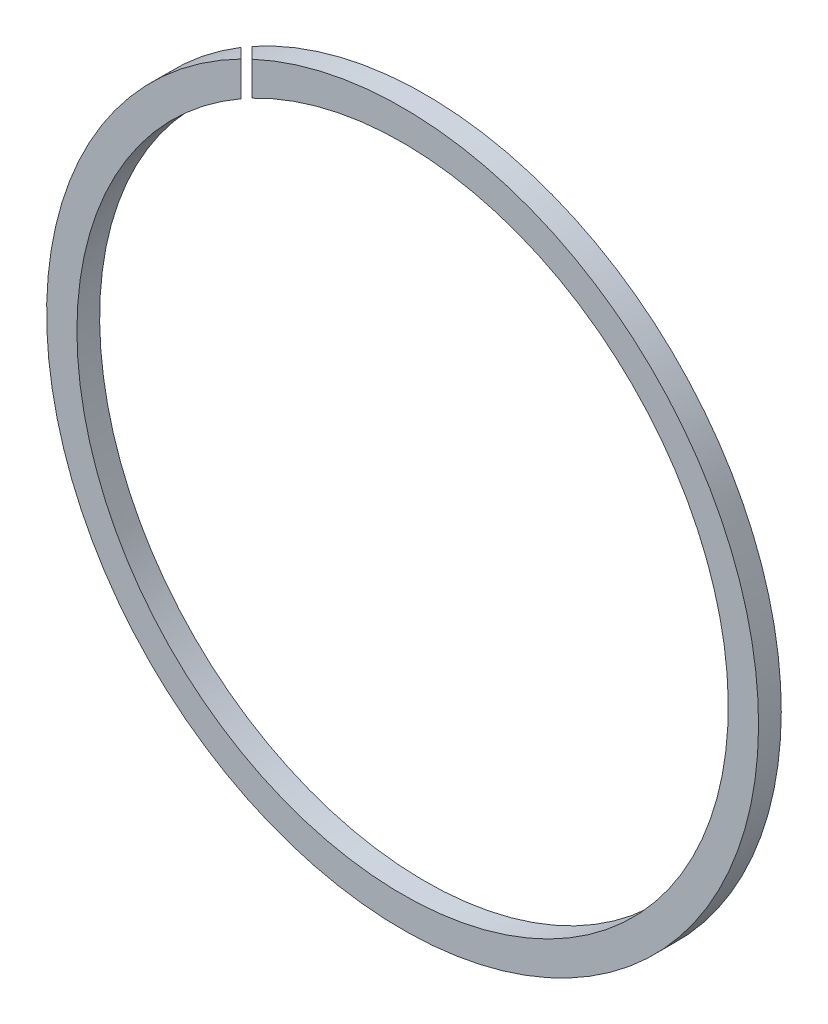
ISO-10303-21;
HEADER;
FILE_DESCRIPTION(('STEP AP214'),'2;1');
FILE_NAME('part.step','',(''),(''),'','','');
FILE_SCHEMA(('AUTOMOTIVE_DESIGN { 1 0 10303 214 1 1 1 1 }'));
ENDSEC;
DATA;
#1=APPLICATION_CONTEXT('core data for automotive mechanical design processes');
#2=APPLICATION_PROTOCOL_DEFINITION('international standard','automotive_design',2000,#1);
#3=PRODUCT_CONTEXT('',#1,'mechanical');
#4=PRODUCT('Part','Part','',(#3));
#5=PRODUCT_RELATED_PRODUCT_CATEGORY('part','',(#4));
#6=PRODUCT_DEFINITION_FORMATION('','',#4);
#7=PRODUCT_DEFINITION_CONTEXT('part definition',#1,'design');
#8=PRODUCT_DEFINITION('design','',#6,#7);
#9=PRODUCT_DEFINITION_SHAPE('','',#8);
#10=(LENGTH_UNIT() NAMED_UNIT(*) SI_UNIT(.MILLI.,.METRE.));
#11=(NAMED_UNIT(*) PLANE_ANGLE_UNIT() SI_UNIT($,.RADIAN.));
#12=(NAMED_UNIT(*) SI_UNIT($,.STERADIAN.) SOLID_ANGLE_UNIT());
#13=UNCERTAINTY_MEASURE_WITH_UNIT(LENGTH_MEASURE(1.E-05),#10,'distance_accuracy_value','');
#14=(GEOMETRIC_REPRESENTATION_CONTEXT(3) GLOBAL_UNCERTAINTY_ASSIGNED_CONTEXT((#13)) GLOBAL_UNIT_ASSIGNED_CONTEXT((#10,
#11,#12)) REPRESENTATION_CONTEXT('',''));
#15=CARTESIAN_POINT('',(0.,0.,0.));
#16=DIRECTION('',(0.,0.,1.));
#17=DIRECTION('',(1.,0.,0.));
#18=AXIS2_PLACEMENT_3D('',#15,#16,#17);
#19=CARTESIAN_POINT('',(0.,0.,1.5));
#20=DIRECTION('',(0.,0.,1.));
#21=DIRECTION('',(1.,0.,0.));
#22=AXIS2_PLACEMENT_3D('',#19,#20,#21);
#23=PLANE('',#22);
#24=CARTESIAN_POINT('',(0.,0.,1.5));
#25=DIRECTION('',(0.,0.,1.));
#26=DIRECTION('',(1.,0.,0.));
#27=AXIS2_PLACEMENT_3D('',#24,#25,#26);
#28=CIRCLE('',#27,47.);
#29=CARTESIAN_POINT('',(-21.3231985388228,41.8846177501233,1.5));
#30=VERTEX_POINT('',#29);
#31=CARTESIAN_POINT('',(-19.9089849764497,42.5750198732484,1.5));
#32=VERTEX_POINT('',#31);
#33=EDGE_CURVE('E92',#30,#32,#28,.T.);
#34=ORIENTED_EDGE('',*,*,#33,.T.);
#35=DIRECTION('',(0.,-1.,0.));
#36=VECTOR('',#35,1.);
#37=CARTESIAN_POINT('',(-19.9089849764497,100.,1.5));
#38=LINE('',#37,#36);
#39=CARTESIAN_POINT('',(-19.9089849764497,38.113413875006,1.5));
#40=VERTEX_POINT('',#39);
#41=EDGE_CURVE('E86',#32,#40,#38,.T.);
#42=ORIENTED_EDGE('',*,*,#41,.T.);
#43=CARTESIAN_POINT('',(0.,0.,1.5));
#44=DIRECTION('',(0.,0.,1.));
#45=DIRECTION('',(1.,0.,0.));
#46=AXIS2_PLACEMENT_3D('',#43,#44,#45);
#47=CIRCLE('',#46,43.);
#48=CARTESIAN_POINT('',(-21.3231985388228,37.3406106548078,1.5));
#49=VERTEX_POINT('',#48);
#50=EDGE_CURVE('E94',#49,#40,#47,.T.);
#51=ORIENTED_EDGE('',*,*,#50,.F.);
#52=DIRECTION('',(0.,-1.,0.));
#53=VECTOR('',#52,1.);
#54=CARTESIAN_POINT('',(-21.3231985388228,100.,1.5));
#55=LINE('',#54,#53);
#56=EDGE_CURVE('E61',#30,#49,#55,.T.);
#57=ORIENTED_EDGE('',*,*,#56,.F.);
#58=EDGE_LOOP('',(#34,#42,#51,#57));
#59=FACE_BOUND('',#58,.T.);
#60=ADVANCED_FACE('F39',(#59),#23,.T.);
#61=CARTESIAN_POINT('',(0.,0.,-1.5));
#62=DIRECTION('',(0.,0.,1.));
#63=DIRECTION('',(1.,0.,0.));
#64=AXIS2_PLACEMENT_3D('',#61,#62,#63);
#65=PLANE('',#64);
#66=DIRECTION('',(0.,-1.,0.));
#67=VECTOR('',#66,1.);
#68=CARTESIAN_POINT('',(-22.9089849764497,100.,-1.5));
#69=LINE('',#68,#67);
#70=CARTESIAN_POINT('',(-22.9089849764497,41.0387427603332,-1.5));
#71=VERTEX_POINT('',#70);
#72=CARTESIAN_POINT('',(-22.9089849764497,36.3892622534286,-1.5));
#73=VERTEX_POINT('',#72);
#74=EDGE_CURVE('E54',#71,#73,#69,.T.);
#75=ORIENTED_EDGE('',*,*,#74,.F.);
#76=CARTESIAN_POINT('',(0.,0.,-1.5));
#77=DIRECTION('',(0.,0.,1.));
#78=DIRECTION('',(1.,0.,0.));
#79=AXIS2_PLACEMENT_3D('',#76,#77,#78);
#80=CIRCLE('',#79,47.);
#81=CARTESIAN_POINT('',(-24.3231985388228,40.2166882381059,-1.5));
#82=VERTEX_POINT('',#81);
#83=EDGE_CURVE('E97',#82,#71,#80,.T.);
#84=ORIENTED_EDGE('',*,*,#83,.F.);
#85=DIRECTION('',(0.,-1.,0.));
#86=VECTOR('',#85,1.);
#87=CARTESIAN_POINT('',(-24.3231985388228,100.,-1.5));
#88=LINE('',#87,#86);
#89=CARTESIAN_POINT('',(-24.3231985388228,35.4595828069227,-1.5));
#90=VERTEX_POINT('',#89);
#91=EDGE_CURVE('E80',#82,#90,#88,.T.);
#92=ORIENTED_EDGE('',*,*,#91,.T.);
#93=CARTESIAN_POINT('',(0.,0.,-1.5));
#94=DIRECTION('',(0.,0.,1.));
#95=DIRECTION('',(1.,0.,0.));
#96=AXIS2_PLACEMENT_3D('',#93,#94,#95);
#97=CIRCLE('',#96,43.);
#98=EDGE_CURVE('E101',#90,#73,#97,.T.);
#99=ORIENTED_EDGE('',*,*,#98,.T.);
#100=EDGE_LOOP('',(#75,#84,#92,#99));
#101=FACE_BOUND('',#100,.T.);
#102=ADVANCED_FACE('F110',(#101),#65,.F.);
#103=CARTESIAN_POINT('',(0.,0.,1.5));
#104=DIRECTION('',(0.,0.,-1.));
#105=DIRECTION('',(-1.,0.,0.));
#106=AXIS2_PLACEMENT_3D('',#103,#104,#105);
#107=CYLINDRICAL_SURFACE('',#106,47.);
#108=CARTESIAN_POINT('',(0.,0.,21.4089849764496));
#109=DIRECTION('',(-0.707106781186546,0.,0.707106781186549));
#110=DIRECTION('',(-0.707106781186549,0.,-0.707106781186546));
#111=AXIS2_PLACEMENT_3D('',#108,#109,#110);
#112=ELLIPSE('',#111,66.4680374315353,47.);
#113=EDGE_CURVE('E85',#32,#71,#112,.T.);
#114=ORIENTED_EDGE('',*,*,#113,.F.);
#115=ORIENTED_EDGE('',*,*,#33,.F.);
#116=CARTESIAN_POINT('',(0.,0.,22.8231985388227));
#117=DIRECTION('',(0.707106781186546,0.,-0.707106781186549));
#118=DIRECTION('',(-0.707106781186549,0.,-0.707106781186546));
#119=AXIS2_PLACEMENT_3D('',#116,#117,#118);
#120=ELLIPSE('',#119,66.4680374315353,47.);
#121=EDGE_CURVE('E77',#82,#30,#120,.T.);
#122=ORIENTED_EDGE('',*,*,#121,.F.);
#123=ORIENTED_EDGE('',*,*,#83,.T.);
#124=EDGE_LOOP('',(#114,#115,#122,#123));
#125=FACE_BOUND('',#124,.T.);
#126=ADVANCED_FACE('F41',(#125),#107,.T.);
#127=CARTESIAN_POINT('',(0.,0.,1.5));
#128=DIRECTION('',(0.,0.,-1.));
#129=DIRECTION('',(-1.,0.,0.));
#130=AXIS2_PLACEMENT_3D('',#127,#128,#129);
#131=CYLINDRICAL_SURFACE('',#130,43.);
#132=ORIENTED_EDGE('',*,*,#50,.T.);
#133=CARTESIAN_POINT('',(0.,0.,21.4089849764496));
#134=DIRECTION('',(-0.707106781186546,0.,0.707106781186549));
#135=DIRECTION('',(-0.707106781186549,0.,-0.707106781186546));
#136=AXIS2_PLACEMENT_3D('',#133,#134,#135);
#137=ELLIPSE('',#136,60.8111831820429,43.);
#138=EDGE_CURVE('E11',#40,#73,#137,.T.);
#139=ORIENTED_EDGE('',*,*,#138,.T.);
#140=ORIENTED_EDGE('',*,*,#98,.F.);
#141=CARTESIAN_POINT('',(0.,0.,22.8231985388227));
#142=DIRECTION('',(0.707106781186546,0.,-0.707106781186549));
#143=DIRECTION('',(-0.707106781186549,0.,-0.707106781186546));
#144=AXIS2_PLACEMENT_3D('',#141,#142,#143);
#145=ELLIPSE('',#144,60.8111831820429,43.);
#146=EDGE_CURVE('E47',#90,#49,#145,.T.);
#147=ORIENTED_EDGE('',*,*,#146,.T.);
#148=EDGE_LOOP('',(#132,#139,#140,#147));
#149=FACE_BOUND('',#148,.T.);
#150=ADVANCED_FACE('F112',(#149),#131,.F.);
#151=CARTESIAN_POINT('',(-21.3231985388228,100.,1.5));
#152=DIRECTION('',(0.707106781186546,0.,-0.707106781186549));
#153=DIRECTION('',(-0.707106781186549,0.,-0.707106781186546));
#154=AXIS2_PLACEMENT_3D('',#151,#152,#153);
#155=PLANE('',#154);
#156=ORIENTED_EDGE('',*,*,#121,.T.);
#157=ORIENTED_EDGE('',*,*,#56,.T.);
#158=ORIENTED_EDGE('',*,*,#146,.F.);
#159=ORIENTED_EDGE('',*,*,#91,.F.);
#160=EDGE_LOOP('',(#156,#157,#158,#159));
#161=FACE_BOUND('',#160,.T.);
#162=ADVANCED_FACE('F78',(#161),#155,.T.);
#163=CARTESIAN_POINT('',(-19.9089849764497,100.,1.5));
#164=DIRECTION('',(-0.707106781186546,0.,0.707106781186549));
#165=DIRECTION('',(0.707106781186549,0.,0.707106781186546));
#166=AXIS2_PLACEMENT_3D('',#163,#164,#165);
#167=PLANE('',#166);
#168=ORIENTED_EDGE('',*,*,#113,.T.);
#169=ORIENTED_EDGE('',*,*,#74,.T.);
#170=ORIENTED_EDGE('',*,*,#138,.F.);
#171=ORIENTED_EDGE('',*,*,#41,.F.);
#172=EDGE_LOOP('',(#168,#169,#170,#171));
#173=FACE_BOUND('',#172,.T.);
#174=ADVANCED_FACE('F113',(#173),#167,.T.);
#175=CLOSED_SHELL('',(#60,#102,#126,#150,#162,#174));
#176=MANIFOLD_SOLID_BREP('B2',#175);
#177=ADVANCED_BREP_SHAPE_REPRESENTATION('',(#18,#176),#14);
#178=SHAPE_DEFINITION_REPRESENTATION(#9,#177);
ENDSEC;
END-ISO-10303-21;
